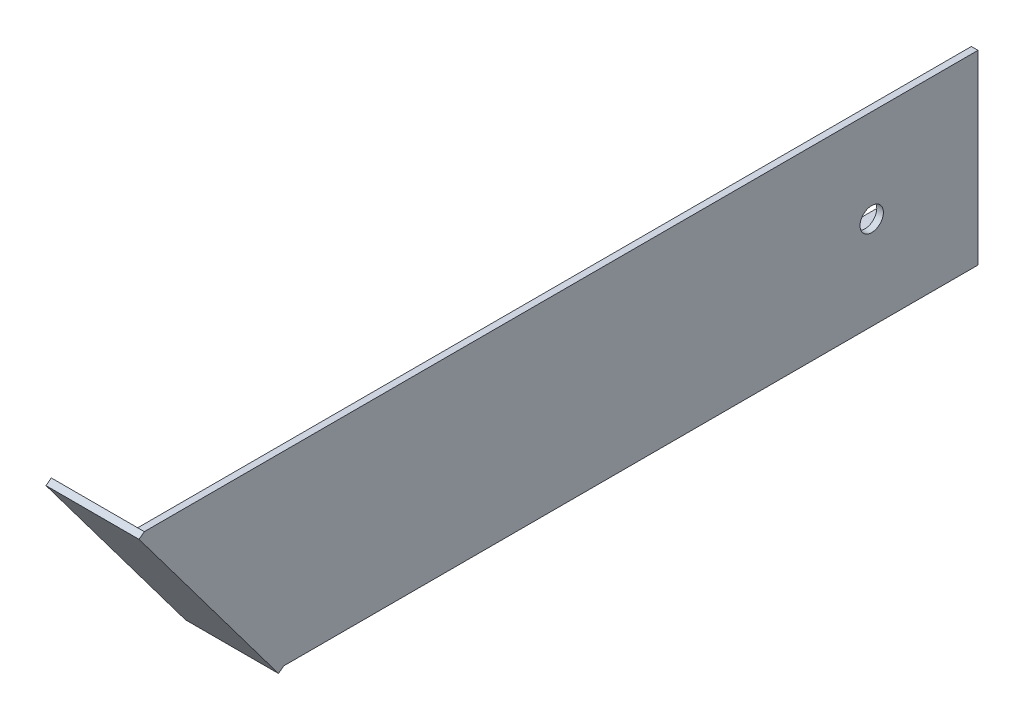
ISO-10303-21;
HEADER;
FILE_DESCRIPTION(('STEP AP214'),'2;1');
FILE_NAME('part.step','',(''),(''),'','','');
FILE_SCHEMA(('AUTOMOTIVE_DESIGN { 1 0 10303 214 1 1 1 1 }'));
ENDSEC;
DATA;
#1=APPLICATION_CONTEXT('core data for automotive mechanical design processes');
#2=APPLICATION_PROTOCOL_DEFINITION('international standard','automotive_design',2000,#1);
#3=PRODUCT_CONTEXT('',#1,'mechanical');
#4=PRODUCT('Part','Part','',(#3));
#5=PRODUCT_RELATED_PRODUCT_CATEGORY('part','',(#4));
#6=PRODUCT_DEFINITION_FORMATION('','',#4);
#7=PRODUCT_DEFINITION_CONTEXT('part definition',#1,'design');
#8=PRODUCT_DEFINITION('design','',#6,#7);
#9=PRODUCT_DEFINITION_SHAPE('','',#8);
#10=(LENGTH_UNIT() NAMED_UNIT(*) SI_UNIT(.MILLI.,.METRE.));
#11=(NAMED_UNIT(*) PLANE_ANGLE_UNIT() SI_UNIT($,.RADIAN.));
#12=(NAMED_UNIT(*) SI_UNIT($,.STERADIAN.) SOLID_ANGLE_UNIT());
#13=UNCERTAINTY_MEASURE_WITH_UNIT(LENGTH_MEASURE(1.E-05),#10,'distance_accuracy_value','');
#14=(GEOMETRIC_REPRESENTATION_CONTEXT(3) GLOBAL_UNCERTAINTY_ASSIGNED_CONTEXT((#13)) GLOBAL_UNIT_ASSIGNED_CONTEXT((#10,
#11,#12)) REPRESENTATION_CONTEXT('',''));
#15=CARTESIAN_POINT('',(0.,0.,0.));
#16=DIRECTION('',(0.,0.,1.));
#17=DIRECTION('',(1.,0.,0.));
#18=AXIS2_PLACEMENT_3D('',#15,#16,#17);
#19=CARTESIAN_POINT('',(0.,0.,199.23125));
#20=DIRECTION('',(-1.,0.,0.));
#21=DIRECTION('',(0.,0.,-1.));
#22=AXIS2_PLACEMENT_3D('',#19,#20,#21);
#23=PLANE('',#22);
#24=DIRECTION('',(0.,0.,-1.));
#25=VECTOR('',#24,1.);
#26=CARTESIAN_POINT('',(0.,0.,199.23125));
#27=LINE('',#26,#25);
#28=CARTESIAN_POINT('',(0.,0.,132.556001855177));
#29=VERTEX_POINT('',#28);
#30=CARTESIAN_POINT('',(0.,0.,-199.23125));
#31=VERTEX_POINT('',#30);
#32=EDGE_CURVE('E11',#29,#31,#27,.T.);
#33=ORIENTED_EDGE('',*,*,#32,.T.);
#34=DIRECTION('',(0.,-1.,0.));
#35=VECTOR('',#34,1.);
#36=CARTESIAN_POINT('',(0.,0.,-199.23125));
#37=LINE('',#36,#35);
#38=CARTESIAN_POINT('',(0.,88.9,-199.23125));
#39=VERTEX_POINT('',#38);
#40=EDGE_CURVE('E186',#39,#31,#37,.T.);
#41=ORIENTED_EDGE('',*,*,#40,.F.);
#42=DIRECTION('',(0.,0.,-1.));
#43=VECTOR('',#42,1.);
#44=CARTESIAN_POINT('',(0.,88.9,199.23125));
#45=LINE('',#44,#43);
#46=CARTESIAN_POINT('',(0.,88.8999999999999,199.23125));
#47=VERTEX_POINT('',#46);
#48=EDGE_CURVE('E79',#47,#39,#45,.T.);
#49=ORIENTED_EDGE('',*,*,#48,.F.);
#50=DIRECTION('',(0.,0.600001429132667,-0.799998928148505));
#51=VECTOR('',#50,1.);
#52=CARTESIAN_POINT('',(0.,86.9949954625037,201.771246596872));
#53=LINE('',#52,#51);
#54=CARTESIAN_POINT('',(0.,86.9949954625037,201.771246596872));
#55=VERTEX_POINT('',#54);
#56=EDGE_CURVE('E163',#55,#47,#53,.T.);
#57=ORIENTED_EDGE('',*,*,#56,.F.);
#58=DIRECTION('',(0.,-0.799998928148505,-0.600001429132667));
#59=VECTOR('',#58,1.);
#60=CARTESIAN_POINT('',(0.,-1.90500453749626,135.095998452048));
#61=LINE('',#60,#59);
#62=CARTESIAN_POINT('',(0.,-1.90500453749626,135.095998452048));
#63=VERTEX_POINT('',#62);
#64=EDGE_CURVE('E152',#55,#63,#61,.T.);
#65=ORIENTED_EDGE('',*,*,#64,.T.);
#66=DIRECTION('',(0.,0.600001429132667,-0.799998928148505));
#67=VECTOR('',#66,1.);
#68=CARTESIAN_POINT('',(0.,-1.90500453749626,135.095998452048));
#69=LINE('',#68,#67);
#70=EDGE_CURVE('E157',#63,#29,#69,.T.);
#71=ORIENTED_EDGE('',*,*,#70,.T.);
#72=EDGE_LOOP('',(#33,#41,#49,#57,#65,#71));
#73=FACE_BOUND('',#72,.T.);
#74=CARTESIAN_POINT('',(0.,44.45,-148.43125));
#75=DIRECTION('',(1.,0.,0.));
#76=DIRECTION('',(0.,1.,0.));
#77=AXIS2_PLACEMENT_3D('',#74,#75,#76);
#78=CIRCLE('',#77,5.58800000000002);
#79=CARTESIAN_POINT('',(0.,50.038,-148.43125));
#80=VERTEX_POINT('',#79);
#81=EDGE_CURVE('E177',#80,#80,#78,.T.);
#82=ORIENTED_EDGE('',*,*,#81,.F.);
#83=EDGE_LOOP('',(#82));
#84=FACE_BOUND('',#83,.T.);
#85=ADVANCED_FACE('F32',(#73,#84),#23,.F.);
#86=CARTESIAN_POINT('',(0.,0.,199.23125));
#87=DIRECTION('',(0.,1.,0.));
#88=DIRECTION('',(0.,0.,1.));
#89=AXIS2_PLACEMENT_3D('',#86,#87,#88);
#90=PLANE('',#89);
#91=DIRECTION('',(1.,0.,0.));
#92=VECTOR('',#91,1.);
#93=CARTESIAN_POINT('',(-44.45,0.,132.556001855177));
#94=LINE('',#93,#92);
#95=CARTESIAN_POINT('',(-44.45,0.,132.556001855177));
#96=VERTEX_POINT('',#95);
#97=EDGE_CURVE('E115',#96,#29,#94,.T.);
#98=ORIENTED_EDGE('',*,*,#97,.F.);
#99=DIRECTION('',(0.,0.,-1.));
#100=VECTOR('',#99,1.);
#101=CARTESIAN_POINT('',(-44.45,0.,199.23125));
#102=LINE('',#101,#100);
#103=CARTESIAN_POINT('',(-44.45,0.,-199.23125));
#104=VERTEX_POINT('',#103);
#105=EDGE_CURVE('E41',#96,#104,#102,.T.);
#106=ORIENTED_EDGE('',*,*,#105,.T.);
#107=DIRECTION('',(-1.,0.,0.));
#108=VECTOR('',#107,1.);
#109=CARTESIAN_POINT('',(0.,0.,-199.23125));
#110=LINE('',#109,#108);
#111=EDGE_CURVE('E112',#31,#104,#110,.T.);
#112=ORIENTED_EDGE('',*,*,#111,.F.);
#113=ORIENTED_EDGE('',*,*,#32,.F.);
#114=EDGE_LOOP('',(#98,#106,#112,#113));
#115=FACE_BOUND('',#114,.T.);
#116=ADVANCED_FACE('F109',(#115),#90,.F.);
#117=CARTESIAN_POINT('',(-44.45,0.,199.23125));
#118=DIRECTION('',(1.,0.,0.));
#119=DIRECTION('',(0.,0.,1.));
#120=AXIS2_PLACEMENT_3D('',#117,#118,#119);
#121=PLANE('',#120);
#122=DIRECTION('',(0.,0.,-1.));
#123=VECTOR('',#122,1.);
#124=CARTESIAN_POINT('',(-44.45,3.175,199.23125));
#125=LINE('',#124,#123);
#126=CARTESIAN_POINT('',(-44.45,3.17500000000001,134.937260717492));
#127=VERTEX_POINT('',#126);
#128=CARTESIAN_POINT('',(-44.45,3.175,-199.23125));
#129=VERTEX_POINT('',#128);
#130=EDGE_CURVE('E99',#127,#129,#125,.T.);
#131=ORIENTED_EDGE('',*,*,#130,.T.);
#132=DIRECTION('',(0.,1.,0.));
#133=VECTOR('',#132,1.);
#134=CARTESIAN_POINT('',(-44.45,0.,-199.23125));
#135=LINE('',#134,#133);
#136=EDGE_CURVE('E123',#104,#129,#135,.T.);
#137=ORIENTED_EDGE('',*,*,#136,.F.);
#138=ORIENTED_EDGE('',*,*,#105,.F.);
#139=DIRECTION('',(0.,0.600001429132667,-0.799998928148505));
#140=VECTOR('',#139,1.);
#141=CARTESIAN_POINT('',(-44.45,-1.90500453749626,135.095998452048));
#142=LINE('',#141,#140);
#143=CARTESIAN_POINT('',(-44.45,-1.90500453749626,135.095998452048));
#144=VERTEX_POINT('',#143);
#145=EDGE_CURVE('E122',#144,#96,#142,.T.);
#146=ORIENTED_EDGE('',*,*,#145,.F.);
#147=DIRECTION('',(0.,0.799998928148505,0.600001429132667));
#148=VECTOR('',#147,1.);
#149=CARTESIAN_POINT('',(-44.45,-1.90500453749626,135.095998452048));
#150=LINE('',#149,#148);
#151=CARTESIAN_POINT('',(-44.45,86.9949954625037,201.771246596872));
#152=VERTEX_POINT('',#151);
#153=EDGE_CURVE('E154',#144,#152,#150,.T.);
#154=ORIENTED_EDGE('',*,*,#153,.T.);
#155=DIRECTION('',(0.,0.600001429132667,-0.799998928148505));
#156=VECTOR('',#155,1.);
#157=CARTESIAN_POINT('',(-44.45,86.9949954625037,201.771246596872));
#158=LINE('',#157,#156);
#159=CARTESIAN_POINT('',(-44.45,88.8999999999999,199.23125));
#160=VERTEX_POINT('',#159);
#161=EDGE_CURVE('E173',#152,#160,#158,.T.);
#162=ORIENTED_EDGE('',*,*,#161,.T.);
#163=DIRECTION('',(0.,0.799998928148505,0.600001429132667));
#164=VECTOR('',#163,1.);
#165=CARTESIAN_POINT('',(-44.45,0.,132.556001855177));
#166=LINE('',#165,#164);
#167=EDGE_CURVE('E165',#127,#160,#166,.T.);
#168=ORIENTED_EDGE('',*,*,#167,.F.);
#169=EDGE_LOOP('',(#131,#137,#138,#146,#154,#162,#168));
#170=FACE_BOUND('',#169,.T.);
#171=ADVANCED_FACE('F118',(#170),#121,.F.);
#172=CARTESIAN_POINT('',(-3.17500000000001,3.175,199.23125));
#173=DIRECTION('',(0.,-1.,0.));
#174=DIRECTION('',(0.,0.,-1.));
#175=AXIS2_PLACEMENT_3D('',#172,#173,#174);
#176=PLANE('',#175);
#177=DIRECTION('',(1.,0.,0.));
#178=VECTOR('',#177,1.);
#179=CARTESIAN_POINT('',(-3.175,3.175,134.937260717492));
#180=LINE('',#179,#178);
#181=CARTESIAN_POINT('',(-3.17500000000001,3.175,134.937260717492));
#182=VERTEX_POINT('',#181);
#183=EDGE_CURVE('E182',#127,#182,#180,.T.);
#184=ORIENTED_EDGE('',*,*,#183,.T.);
#185=DIRECTION('',(0.,0.,-1.));
#186=VECTOR('',#185,1.);
#187=CARTESIAN_POINT('',(-3.17500000000001,3.175,199.23125));
#188=LINE('',#187,#186);
#189=CARTESIAN_POINT('',(-3.17500000000001,3.175,-199.23125));
#190=VERTEX_POINT('',#189);
#191=EDGE_CURVE('E97',#182,#190,#188,.T.);
#192=ORIENTED_EDGE('',*,*,#191,.T.);
#193=DIRECTION('',(1.,0.,0.));
#194=VECTOR('',#193,1.);
#195=CARTESIAN_POINT('',(-3.17500000000001,3.175,-199.23125));
#196=LINE('',#195,#194);
#197=EDGE_CURVE('E89',#129,#190,#196,.T.);
#198=ORIENTED_EDGE('',*,*,#197,.F.);
#199=ORIENTED_EDGE('',*,*,#130,.F.);
#200=EDGE_LOOP('',(#184,#192,#198,#199));
#201=FACE_BOUND('',#200,.T.);
#202=ADVANCED_FACE('F193',(#201),#176,.F.);
#203=CARTESIAN_POINT('',(-3.175,88.9,199.23125));
#204=DIRECTION('',(1.,0.,0.));
#205=DIRECTION('',(0.,-1.,0.));
#206=AXIS2_PLACEMENT_3D('',#203,#204,#205);
#207=PLANE('',#206);
#208=DIRECTION('',(0.,0.799998928148505,0.600001429132667));
#209=VECTOR('',#208,1.);
#210=CARTESIAN_POINT('',(-3.175,88.9,199.23125));
#211=LINE('',#210,#209);
#212=CARTESIAN_POINT('',(-3.175,88.9,199.23125));
#213=VERTEX_POINT('',#212);
#214=EDGE_CURVE('E96',#182,#213,#211,.T.);
#215=ORIENTED_EDGE('',*,*,#214,.T.);
#216=DIRECTION('',(0.,0.,-1.));
#217=VECTOR('',#216,1.);
#218=CARTESIAN_POINT('',(-3.175,88.9,199.23125));
#219=LINE('',#218,#217);
#220=CARTESIAN_POINT('',(-3.175,88.9,-199.23125));
#221=VERTEX_POINT('',#220);
#222=EDGE_CURVE('E76',#213,#221,#219,.T.);
#223=ORIENTED_EDGE('',*,*,#222,.T.);
#224=DIRECTION('',(0.,1.,0.));
#225=VECTOR('',#224,1.);
#226=CARTESIAN_POINT('',(-3.175,88.9,-199.23125));
#227=LINE('',#226,#225);
#228=EDGE_CURVE('E84',#190,#221,#227,.T.);
#229=ORIENTED_EDGE('',*,*,#228,.F.);
#230=ORIENTED_EDGE('',*,*,#191,.F.);
#231=EDGE_LOOP('',(#215,#223,#229,#230));
#232=FACE_BOUND('',#231,.T.);
#233=CARTESIAN_POINT('',(-3.175,44.45,-148.43125));
#234=DIRECTION('',(-1.,0.,0.));
#235=DIRECTION('',(0.,-1.,0.));
#236=AXIS2_PLACEMENT_3D('',#233,#234,#235);
#237=CIRCLE('',#236,5.58800000000002);
#238=CARTESIAN_POINT('',(-3.17500000000001,38.862,-148.43125));
#239=VERTEX_POINT('',#238);
#240=EDGE_CURVE('E35',#239,#239,#237,.F.);
#241=ORIENTED_EDGE('',*,*,#240,.T.);
#242=EDGE_LOOP('',(#241));
#243=FACE_BOUND('',#242,.T.);
#244=ADVANCED_FACE('F94',(#232,#243),#207,.F.);
#245=CARTESIAN_POINT('',(0.,88.9,199.23125));
#246=DIRECTION('',(0.,-1.,0.));
#247=DIRECTION('',(0.,0.,-1.));
#248=AXIS2_PLACEMENT_3D('',#245,#246,#247);
#249=PLANE('',#248);
#250=DIRECTION('',(1.,0.,0.));
#251=VECTOR('',#250,1.);
#252=CARTESIAN_POINT('',(0.,88.9,-199.23125));
#253=LINE('',#252,#251);
#254=EDGE_CURVE('E71',#221,#39,#253,.T.);
#255=ORIENTED_EDGE('',*,*,#254,.F.);
#256=ORIENTED_EDGE('',*,*,#222,.F.);
#257=DIRECTION('',(1.,0.,0.));
#258=VECTOR('',#257,1.);
#259=CARTESIAN_POINT('',(0.,88.9,199.23125));
#260=LINE('',#259,#258);
#261=EDGE_CURVE('E83',#213,#47,#260,.T.);
#262=ORIENTED_EDGE('',*,*,#261,.T.);
#263=ORIENTED_EDGE('',*,*,#48,.T.);
#264=EDGE_LOOP('',(#255,#256,#262,#263));
#265=FACE_BOUND('',#264,.T.);
#266=ADVANCED_FACE('F73',(#265),#249,.F.);
#267=CARTESIAN_POINT('',(0.,0.,-199.23125));
#268=DIRECTION('',(0.,0.,-1.));
#269=DIRECTION('',(1.,0.,0.));
#270=AXIS2_PLACEMENT_3D('',#267,#268,#269);
#271=PLANE('',#270);
#272=ORIENTED_EDGE('',*,*,#40,.T.);
#273=ORIENTED_EDGE('',*,*,#111,.T.);
#274=ORIENTED_EDGE('',*,*,#136,.T.);
#275=ORIENTED_EDGE('',*,*,#197,.T.);
#276=ORIENTED_EDGE('',*,*,#228,.T.);
#277=ORIENTED_EDGE('',*,*,#254,.T.);
#278=EDGE_LOOP('',(#272,#273,#274,#275,#276,#277));
#279=FACE_BOUND('',#278,.T.);
#280=ADVANCED_FACE('F87',(#279),#271,.T.);
#281=CARTESIAN_POINT('',(-44.45,44.45,-148.43125));
#282=DIRECTION('',(1.,0.,0.));
#283=DIRECTION('',(0.,-1.,0.));
#284=AXIS2_PLACEMENT_3D('',#281,#282,#283);
#285=CYLINDRICAL_SURFACE('',#284,5.58800000000002);
#286=ORIENTED_EDGE('',*,*,#81,.T.);
#287=EDGE_LOOP('',(#286));
#288=FACE_BOUND('',#287,.T.);
#289=ORIENTED_EDGE('',*,*,#240,.F.);
#290=EDGE_LOOP('',(#289));
#291=FACE_BOUND('',#290,.T.);
#292=ADVANCED_FACE('F224',(#288,#291),#285,.F.);
#293=CARTESIAN_POINT('',(0.,-63.6269471941627,84.8356138589076));
#294=DIRECTION('',(0.,0.600001429132667,-0.799998928148505));
#295=DIRECTION('',(0.,0.799998928148505,0.600001429132667));
#296=AXIS2_PLACEMENT_3D('',#293,#294,#295);
#297=PLANE('',#296);
#298=ORIENTED_EDGE('',*,*,#183,.F.);
#299=ORIENTED_EDGE('',*,*,#167,.T.);
#300=DIRECTION('',(1.,0.,0.));
#301=VECTOR('',#300,1.);
#302=CARTESIAN_POINT('',(0.,88.8999999999999,199.23125));
#303=LINE('',#302,#301);
#304=EDGE_CURVE('E48',#160,#213,#303,.T.);
#305=ORIENTED_EDGE('',*,*,#304,.T.);
#306=ORIENTED_EDGE('',*,*,#214,.F.);
#307=EDGE_LOOP('',(#298,#299,#305,#306));
#308=FACE_BOUND('',#307,.T.);
#309=ADVANCED_FACE('F194',(#308),#297,.T.);
#310=CARTESIAN_POINT('',(0.,-1.90500453749626,135.095998452048));
#311=DIRECTION('',(0.,0.799998928148505,0.600001429132667));
#312=DIRECTION('',(0.,-0.600001429132668,0.799998928148505));
#313=AXIS2_PLACEMENT_3D('',#310,#311,#312);
#314=PLANE('',#313);
#315=ORIENTED_EDGE('',*,*,#97,.T.);
#316=ORIENTED_EDGE('',*,*,#70,.F.);
#317=DIRECTION('',(-1.,0.,0.));
#318=VECTOR('',#317,1.);
#319=CARTESIAN_POINT('',(0.,-1.90500453749626,135.095998452048));
#320=LINE('',#319,#318);
#321=EDGE_CURVE('E148',#63,#144,#320,.T.);
#322=ORIENTED_EDGE('',*,*,#321,.T.);
#323=ORIENTED_EDGE('',*,*,#145,.T.);
#324=EDGE_LOOP('',(#315,#316,#322,#323));
#325=FACE_BOUND('',#324,.T.);
#326=ADVANCED_FACE('F158',(#325),#314,.F.);
#327=CARTESIAN_POINT('',(0.,86.9949954625037,201.771246596872));
#328=DIRECTION('',(0.,-0.799998928148505,-0.600001429132668));
#329=DIRECTION('',(0.,0.600001429132668,-0.799998928148505));
#330=AXIS2_PLACEMENT_3D('',#327,#328,#329);
#331=PLANE('',#330);
#332=ORIENTED_EDGE('',*,*,#304,.F.);
#333=ORIENTED_EDGE('',*,*,#161,.F.);
#334=DIRECTION('',(1.,0.,0.));
#335=VECTOR('',#334,1.);
#336=CARTESIAN_POINT('',(0.,86.9949954625037,201.771246596872));
#337=LINE('',#336,#335);
#338=EDGE_CURVE('E169',#152,#55,#337,.T.);
#339=ORIENTED_EDGE('',*,*,#338,.T.);
#340=ORIENTED_EDGE('',*,*,#56,.T.);
#341=ORIENTED_EDGE('',*,*,#261,.F.);
#342=EDGE_LOOP('',(#332,#333,#339,#340,#341));
#343=FACE_BOUND('',#342,.T.);
#344=ADVANCED_FACE('F197',(#343),#331,.F.);
#345=CARTESIAN_POINT('',(0.,-65.5319517316589,87.3756104557791));
#346=DIRECTION('',(0.,0.600001429132667,-0.799998928148505));
#347=DIRECTION('',(0.,0.799998928148505,0.600001429132667));
#348=AXIS2_PLACEMENT_3D('',#345,#346,#347);
#349=PLANE('',#348);
#350=ORIENTED_EDGE('',*,*,#64,.F.);
#351=ORIENTED_EDGE('',*,*,#338,.F.);
#352=ORIENTED_EDGE('',*,*,#153,.F.);
#353=ORIENTED_EDGE('',*,*,#321,.F.);
#354=EDGE_LOOP('',(#350,#351,#352,#353));
#355=FACE_BOUND('',#354,.T.);
#356=ADVANCED_FACE('F150',(#355),#349,.F.);
#357=CLOSED_SHELL('',(#85,#116,#171,#202,#244,#266,#280,#292,#309,#326,#344,#356));
#358=MANIFOLD_SOLID_BREP('B2',#357);
#359=ADVANCED_BREP_SHAPE_REPRESENTATION('',(#18,#358),#14);
#360=SHAPE_DEFINITION_REPRESENTATION(#9,#359);
ENDSEC;
END-ISO-10303-21;
